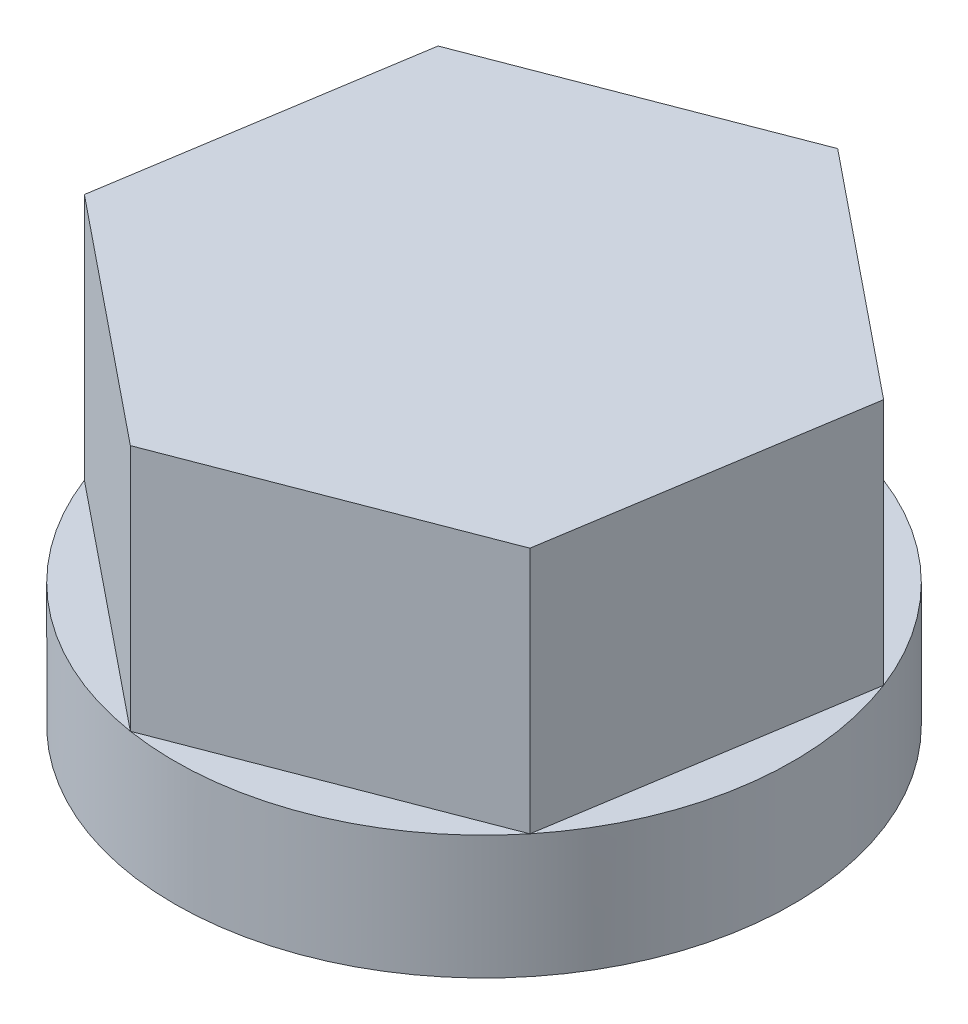
ISO-10303-21;
HEADER;
FILE_DESCRIPTION(('STEP AP214'),'2;1');
FILE_NAME('part.step','',(''),(''),'','','');
FILE_SCHEMA(('AUTOMOTIVE_DESIGN { 1 0 10303 214 1 1 1 1 }'));
ENDSEC;
DATA;
#1=APPLICATION_CONTEXT('core data for automotive mechanical design processes');
#2=APPLICATION_PROTOCOL_DEFINITION('international standard','automotive_design',2000,#1);
#3=PRODUCT_CONTEXT('',#1,'mechanical');
#4=PRODUCT('Part','Part','',(#3));
#5=PRODUCT_RELATED_PRODUCT_CATEGORY('part','',(#4));
#6=PRODUCT_DEFINITION_FORMATION('','',#4);
#7=PRODUCT_DEFINITION_CONTEXT('part definition',#1,'design');
#8=PRODUCT_DEFINITION('design','',#6,#7);
#9=PRODUCT_DEFINITION_SHAPE('','',#8);
#10=(LENGTH_UNIT() NAMED_UNIT(*) SI_UNIT(.MILLI.,.METRE.));
#11=(NAMED_UNIT(*) PLANE_ANGLE_UNIT() SI_UNIT($,.RADIAN.));
#12=(NAMED_UNIT(*) SI_UNIT($,.STERADIAN.) SOLID_ANGLE_UNIT());
#13=UNCERTAINTY_MEASURE_WITH_UNIT(LENGTH_MEASURE(1.E-05),#10,'distance_accuracy_value','');
#14=(GEOMETRIC_REPRESENTATION_CONTEXT(3) GLOBAL_UNCERTAINTY_ASSIGNED_CONTEXT((#13)) GLOBAL_UNIT_ASSIGNED_CONTEXT((#10,
#11,#12)) REPRESENTATION_CONTEXT('',''));
#15=CARTESIAN_POINT('',(0.,0.,0.));
#16=DIRECTION('',(0.,0.,1.));
#17=DIRECTION('',(1.,0.,0.));
#18=AXIS2_PLACEMENT_3D('',#15,#16,#17);
#19=CARTESIAN_POINT('',(0.,1.5,0.));
#20=DIRECTION('',(0.,-1.,0.));
#21=DIRECTION('',(0.,0.,-1.));
#22=AXIS2_PLACEMENT_3D('',#19,#20,#21);
#23=CYLINDRICAL_SURFACE('',#22,1.25);
#24=CARTESIAN_POINT('',(0.,0.,0.));
#25=DIRECTION('',(0.,1.,0.));
#26=DIRECTION('',(0.,0.,1.));
#27=AXIS2_PLACEMENT_3D('',#24,#25,#26);
#28=CIRCLE('',#27,1.25);
#29=CARTESIAN_POINT('',(0.,0.,1.25));
#30=VERTEX_POINT('',#29);
#31=EDGE_CURVE('E12',#30,#30,#28,.T.);
#32=ORIENTED_EDGE('',*,*,#31,.T.);
#33=EDGE_LOOP('',(#32));
#34=FACE_BOUND('',#33,.T.);
#35=CARTESIAN_POINT('',(0.,0.5,0.));
#36=DIRECTION('',(0.,1.,0.));
#37=DIRECTION('',(0.,0.,1.));
#38=AXIS2_PLACEMENT_3D('',#35,#36,#37);
#39=CIRCLE('',#38,1.25);
#40=CARTESIAN_POINT('',(0.971838923851469,0.5,0.786148272329857));
#41=VERTEX_POINT('',#40);
#42=CARTESIAN_POINT('',(1.16674383690464,0.5,-0.448563060276977));
#43=VERTEX_POINT('',#42);
#44=EDGE_CURVE('E146',#41,#43,#39,.T.);
#45=ORIENTED_EDGE('',*,*,#44,.F.);
#46=CARTESIAN_POINT('',(0.,0.5,0.));
#47=DIRECTION('',(0.,1.,0.));
#48=DIRECTION('',(0.,0.,1.));
#49=AXIS2_PLACEMENT_3D('',#46,#47,#48);
#50=CIRCLE('',#49,1.25);
#51=CARTESIAN_POINT('',(-0.194904913053166,0.5,1.23471133260683));
#52=VERTEX_POINT('',#51);
#53=EDGE_CURVE('E154',#52,#41,#50,.T.);
#54=ORIENTED_EDGE('',*,*,#53,.F.);
#55=CARTESIAN_POINT('',(0.,0.5,0.));
#56=DIRECTION('',(0.,1.,0.));
#57=DIRECTION('',(0.,0.,1.));
#58=AXIS2_PLACEMENT_3D('',#55,#56,#57);
#59=CIRCLE('',#58,1.25);
#60=CARTESIAN_POINT('',(-1.16674383690464,0.5,0.448563060276977));
#61=VERTEX_POINT('',#60);
#62=EDGE_CURVE('E385',#61,#52,#59,.T.);
#63=ORIENTED_EDGE('',*,*,#62,.F.);
#64=CARTESIAN_POINT('',(0.,0.5,0.));
#65=DIRECTION('',(0.,1.,0.));
#66=DIRECTION('',(0.,0.,1.));
#67=AXIS2_PLACEMENT_3D('',#64,#65,#66);
#68=CIRCLE('',#67,1.25);
#69=CARTESIAN_POINT('',(-0.971838923851471,0.5,-0.786148272329855));
#70=VERTEX_POINT('',#69);
#71=EDGE_CURVE('E182',#70,#61,#68,.T.);
#72=ORIENTED_EDGE('',*,*,#71,.F.);
#73=CARTESIAN_POINT('',(0.,0.5,0.));
#74=DIRECTION('',(0.,1.,0.));
#75=DIRECTION('',(0.,0.,1.));
#76=AXIS2_PLACEMENT_3D('',#73,#74,#75);
#77=CIRCLE('',#76,1.25);
#78=CARTESIAN_POINT('',(0.194904913053166,0.5,-1.23471133260683));
#79=VERTEX_POINT('',#78);
#80=EDGE_CURVE('E361',#79,#70,#77,.T.);
#81=ORIENTED_EDGE('',*,*,#80,.F.);
#82=CARTESIAN_POINT('',(0.,0.5,0.));
#83=DIRECTION('',(0.,1.,0.));
#84=DIRECTION('',(0.,0.,1.));
#85=AXIS2_PLACEMENT_3D('',#82,#83,#84);
#86=CIRCLE('',#85,1.25);
#87=EDGE_CURVE('E157',#43,#79,#86,.T.);
#88=ORIENTED_EDGE('',*,*,#87,.F.);
#89=EDGE_LOOP('',(#45,#54,#63,#72,#81,#88));
#90=FACE_BOUND('',#89,.T.);
#91=ADVANCED_FACE('F75',(#34,#90),#23,.T.);
#92=CARTESIAN_POINT('',(0.,1.5,0.));
#93=DIRECTION('',(0.,1.,0.));
#94=DIRECTION('',(0.,0.,1.));
#95=AXIS2_PLACEMENT_3D('',#92,#93,#94);
#96=PLANE('',#95);
#97=DIRECTION('',(0.93339506952371,0.,-0.358850448221581));
#98=VECTOR('',#97,1.);
#99=CARTESIAN_POINT('',(0.388467005399151,1.5,1.01042980246834));
#100=LINE('',#99,#98);
#101=CARTESIAN_POINT('',(-0.194904913053166,1.5,1.23471133260683));
#102=VERTEX_POINT('',#101);
#103=CARTESIAN_POINT('',(0.971838923851469,1.5,0.786148272329857));
#104=VERTEX_POINT('',#103);
#105=EDGE_CURVE('E166',#102,#104,#100,.T.);
#106=ORIENTED_EDGE('',*,*,#105,.T.);
#107=DIRECTION('',(0.155923930442533,0.,-0.987769066085465));
#108=VECTOR('',#107,1.);
#109=CARTESIAN_POINT('',(1.06929138037805,1.5,0.16879260602644));
#110=LINE('',#109,#108);
#111=CARTESIAN_POINT('',(1.16674383690464,1.5,-0.448563060276977));
#112=VERTEX_POINT('',#111);
#113=EDGE_CURVE('E134',#104,#112,#110,.T.);
#114=ORIENTED_EDGE('',*,*,#113,.T.);
#115=DIRECTION('',(-0.777471139081176,0.,-0.628918617863885));
#116=VECTOR('',#115,1.);
#117=CARTESIAN_POINT('',(0.680824374978901,1.5,-0.841637196441903));
#118=LINE('',#117,#116);
#119=CARTESIAN_POINT('',(0.194904913053166,1.5,-1.23471133260683));
#120=VERTEX_POINT('',#119);
#121=EDGE_CURVE('E375',#112,#120,#118,.T.);
#122=ORIENTED_EDGE('',*,*,#121,.T.);
#123=DIRECTION('',(-0.93339506952371,0.,0.35885044822158));
#124=VECTOR('',#123,1.);
#125=CARTESIAN_POINT('',(-0.388467005399151,1.5,-1.01042980246834));
#126=LINE('',#125,#124);
#127=CARTESIAN_POINT('',(-0.971838923851471,1.5,-0.786148272329855));
#128=VERTEX_POINT('',#127);
#129=EDGE_CURVE('E98',#120,#128,#126,.T.);
#130=ORIENTED_EDGE('',*,*,#129,.T.);
#131=DIRECTION('',(-0.155923930442534,0.,0.987769066085465));
#132=VECTOR('',#131,1.);
#133=CARTESIAN_POINT('',(-1.06929138037805,1.5,-0.16879260602644));
#134=LINE('',#133,#132);
#135=CARTESIAN_POINT('',(-1.16674383690464,1.5,0.448563060276976));
#136=VERTEX_POINT('',#135);
#137=EDGE_CURVE('E183',#128,#136,#134,.T.);
#138=ORIENTED_EDGE('',*,*,#137,.T.);
#139=DIRECTION('',(0.777471139081176,0.,0.628918617863885));
#140=VECTOR('',#139,1.);
#141=CARTESIAN_POINT('',(-0.680824374978902,1.5,0.841637196441903));
#142=LINE('',#141,#140);
#143=EDGE_CURVE('E90',#136,#102,#142,.T.);
#144=ORIENTED_EDGE('',*,*,#143,.T.);
#145=EDGE_LOOP('',(#106,#114,#122,#130,#138,#144));
#146=FACE_BOUND('',#145,.T.);
#147=ADVANCED_FACE('F204',(#146),#96,.T.);
#148=CARTESIAN_POINT('',(0.,0.,0.));
#149=DIRECTION('',(0.,1.,0.));
#150=DIRECTION('',(0.,0.,1.));
#151=AXIS2_PLACEMENT_3D('',#148,#149,#150);
#152=PLANE('',#151);
#153=CARTESIAN_POINT('',(0.,0.,0.));
#154=DIRECTION('',(0.,-1.,0.));
#155=DIRECTION('',(0.,0.,-1.));
#156=AXIS2_PLACEMENT_3D('',#153,#154,#155);
#157=CIRCLE('',#156,0.95);
#158=CARTESIAN_POINT('',(0.,0.,-0.95));
#159=VERTEX_POINT('',#158);
#160=EDGE_CURVE('E140',#159,#159,#157,.T.);
#161=ORIENTED_EDGE('',*,*,#160,.F.);
#162=EDGE_LOOP('',(#161));
#163=FACE_BOUND('',#162,.T.);
#164=ORIENTED_EDGE('',*,*,#31,.F.);
#165=EDGE_LOOP('',(#164));
#166=FACE_BOUND('',#165,.T.);
#167=ADVANCED_FACE('F201',(#163,#166),#152,.F.);
#168=CARTESIAN_POINT('',(0.,1.2,0.));
#169=DIRECTION('',(0.,-1.,0.));
#170=DIRECTION('',(0.,0.,-1.));
#171=AXIS2_PLACEMENT_3D('',#168,#169,#170);
#172=CYLINDRICAL_SURFACE('',#171,0.95);
#173=CARTESIAN_POINT('',(0.,1.2,0.));
#174=DIRECTION('',(0.,-1.,0.));
#175=DIRECTION('',(0.,0.,-1.));
#176=AXIS2_PLACEMENT_3D('',#173,#174,#175);
#177=CIRCLE('',#176,0.95);
#178=CARTESIAN_POINT('',(0.,1.2,-0.95));
#179=VERTEX_POINT('',#178);
#180=EDGE_CURVE('E83',#179,#179,#177,.T.);
#181=ORIENTED_EDGE('',*,*,#180,.F.);
#182=EDGE_LOOP('',(#181));
#183=FACE_BOUND('',#182,.T.);
#184=ORIENTED_EDGE('',*,*,#160,.T.);
#185=EDGE_LOOP('',(#184));
#186=FACE_BOUND('',#185,.T.);
#187=ADVANCED_FACE('F199',(#183,#186),#172,.F.);
#188=CARTESIAN_POINT('',(0.,1.2,0.));
#189=DIRECTION('',(0.,-1.,0.));
#190=DIRECTION('',(0.,0.,-1.));
#191=AXIS2_PLACEMENT_3D('',#188,#189,#190);
#192=PLANE('',#191);
#193=ORIENTED_EDGE('',*,*,#180,.T.);
#194=EDGE_LOOP('',(#193));
#195=FACE_BOUND('',#194,.T.);
#196=ADVANCED_FACE('F218',(#195),#192,.T.);
#197=CARTESIAN_POINT('',(0.388467005399151,0.5,1.01042980246834));
#198=DIRECTION('',(0.358850448221581,0.,0.93339506952371));
#199=DIRECTION('',(0.93339506952371,0.,-0.358850448221581));
#200=AXIS2_PLACEMENT_3D('',#197,#198,#199);
#201=PLANE('',#200);
#202=ORIENTED_EDGE('',*,*,#105,.F.);
#203=DIRECTION('',(0.,1.,0.));
#204=VECTOR('',#203,1.);
#205=CARTESIAN_POINT('',(-0.194904913053166,0.5,1.23471133260683));
#206=LINE('',#205,#204);
#207=EDGE_CURVE('E141',#52,#102,#206,.T.);
#208=ORIENTED_EDGE('',*,*,#207,.F.);
#209=DIRECTION('',(0.93339506952371,0.,-0.358850448221581));
#210=VECTOR('',#209,1.);
#211=CARTESIAN_POINT('',(0.388467005399151,0.5,1.01042980246834));
#212=LINE('',#211,#210);
#213=EDGE_CURVE('E162',#52,#41,#212,.T.);
#214=ORIENTED_EDGE('',*,*,#213,.T.);
#215=DIRECTION('',(0.,1.,0.));
#216=VECTOR('',#215,1.);
#217=CARTESIAN_POINT('',(0.971838923851469,0.5,0.786148272329857));
#218=LINE('',#217,#216);
#219=EDGE_CURVE('E128',#41,#104,#218,.T.);
#220=ORIENTED_EDGE('',*,*,#219,.T.);
#221=EDGE_LOOP('',(#202,#208,#214,#220));
#222=FACE_BOUND('',#221,.T.);
#223=ADVANCED_FACE('F163',(#222),#201,.T.);
#224=CARTESIAN_POINT('',(0.,0.5,0.));
#225=DIRECTION('',(0.,1.,0.));
#226=DIRECTION('',(0.,0.,1.));
#227=AXIS2_PLACEMENT_3D('',#224,#225,#226);
#228=PLANE('',#227);
#229=ORIENTED_EDGE('',*,*,#213,.F.);
#230=ORIENTED_EDGE('',*,*,#53,.T.);
#231=EDGE_LOOP('',(#229,#230));
#232=FACE_BOUND('',#231,.T.);
#233=ADVANCED_FACE('F168',(#232),#228,.T.);
#234=CARTESIAN_POINT('',(-1.06929138037805,0.5,-0.16879260602644));
#235=DIRECTION('',(-0.987769066085465,0.,-0.155923930442534));
#236=DIRECTION('',(-0.155923930442534,0.,0.987769066085465));
#237=AXIS2_PLACEMENT_3D('',#234,#235,#236);
#238=PLANE('',#237);
#239=ORIENTED_EDGE('',*,*,#137,.F.);
#240=DIRECTION('',(0.,1.,0.));
#241=VECTOR('',#240,1.);
#242=CARTESIAN_POINT('',(-0.971838923851471,0.5,-0.786148272329855));
#243=LINE('',#242,#241);
#244=EDGE_CURVE('E176',#70,#128,#243,.T.);
#245=ORIENTED_EDGE('',*,*,#244,.F.);
#246=DIRECTION('',(-0.155923930442534,0.,0.987769066085465));
#247=VECTOR('',#246,1.);
#248=CARTESIAN_POINT('',(-1.06929138037805,0.5,-0.16879260602644));
#249=LINE('',#248,#247);
#250=EDGE_CURVE('E178',#70,#61,#249,.T.);
#251=ORIENTED_EDGE('',*,*,#250,.T.);
#252=DIRECTION('',(0.,1.,0.));
#253=VECTOR('',#252,1.);
#254=CARTESIAN_POINT('',(-1.16674383690464,0.5,0.448563060276977));
#255=LINE('',#254,#253);
#256=EDGE_CURVE('E383',#61,#136,#255,.T.);
#257=ORIENTED_EDGE('',*,*,#256,.T.);
#258=EDGE_LOOP('',(#239,#245,#251,#257));
#259=FACE_BOUND('',#258,.T.);
#260=ADVANCED_FACE('F223',(#259),#238,.T.);
#261=CARTESIAN_POINT('',(0.,0.5,0.));
#262=DIRECTION('',(0.,1.,0.));
#263=DIRECTION('',(0.,0.,1.));
#264=AXIS2_PLACEMENT_3D('',#261,#262,#263);
#265=PLANE('',#264);
#266=ORIENTED_EDGE('',*,*,#250,.F.);
#267=ORIENTED_EDGE('',*,*,#71,.T.);
#268=EDGE_LOOP('',(#266,#267));
#269=FACE_BOUND('',#268,.T.);
#270=ADVANCED_FACE('F226',(#269),#265,.T.);
#271=CARTESIAN_POINT('',(0.680824374978901,0.5,-0.841637196441903));
#272=DIRECTION('',(0.628918617863884,0.,-0.777471139081176));
#273=DIRECTION('',(-0.777471139081176,0.,-0.628918617863884));
#274=AXIS2_PLACEMENT_3D('',#271,#272,#273);
#275=PLANE('',#274);
#276=ORIENTED_EDGE('',*,*,#121,.F.);
#277=DIRECTION('',(0.,1.,0.));
#278=VECTOR('',#277,1.);
#279=CARTESIAN_POINT('',(1.16674383690464,0.5,-0.448563060276977));
#280=LINE('',#279,#278);
#281=EDGE_CURVE('E190',#43,#112,#280,.T.);
#282=ORIENTED_EDGE('',*,*,#281,.F.);
#283=DIRECTION('',(-0.777471139081176,0.,-0.628918617863885));
#284=VECTOR('',#283,1.);
#285=CARTESIAN_POINT('',(0.680824374978901,0.5,-0.841637196441903));
#286=LINE('',#285,#284);
#287=EDGE_CURVE('E371',#43,#79,#286,.T.);
#288=ORIENTED_EDGE('',*,*,#287,.T.);
#289=DIRECTION('',(0.,1.,0.));
#290=VECTOR('',#289,1.);
#291=CARTESIAN_POINT('',(0.194904913053166,0.5,-1.23471133260683));
#292=LINE('',#291,#290);
#293=EDGE_CURVE('E368',#79,#120,#292,.T.);
#294=ORIENTED_EDGE('',*,*,#293,.T.);
#295=EDGE_LOOP('',(#276,#282,#288,#294));
#296=FACE_BOUND('',#295,.T.);
#297=ADVANCED_FACE('F230',(#296),#275,.T.);
#298=CARTESIAN_POINT('',(0.,0.5,0.));
#299=DIRECTION('',(0.,1.,0.));
#300=DIRECTION('',(0.,0.,1.));
#301=AXIS2_PLACEMENT_3D('',#298,#299,#300);
#302=PLANE('',#301);
#303=ORIENTED_EDGE('',*,*,#287,.F.);
#304=ORIENTED_EDGE('',*,*,#87,.T.);
#305=EDGE_LOOP('',(#303,#304));
#306=FACE_BOUND('',#305,.T.);
#307=ADVANCED_FACE('F238',(#306),#302,.T.);
#308=CARTESIAN_POINT('',(-0.680824374978902,0.5,0.841637196441903));
#309=DIRECTION('',(-0.628918617863885,0.,0.777471139081176));
#310=DIRECTION('',(0.777471139081176,0.,0.628918617863885));
#311=AXIS2_PLACEMENT_3D('',#308,#309,#310);
#312=PLANE('',#311);
#313=ORIENTED_EDGE('',*,*,#143,.F.);
#314=ORIENTED_EDGE('',*,*,#256,.F.);
#315=DIRECTION('',(0.777471139081176,0.,0.628918617863885));
#316=VECTOR('',#315,1.);
#317=CARTESIAN_POINT('',(-0.680824374978902,0.5,0.841637196441903));
#318=LINE('',#317,#316);
#319=EDGE_CURVE('E389',#61,#52,#318,.T.);
#320=ORIENTED_EDGE('',*,*,#319,.T.);
#321=ORIENTED_EDGE('',*,*,#207,.T.);
#322=EDGE_LOOP('',(#313,#314,#320,#321));
#323=FACE_BOUND('',#322,.T.);
#324=ADVANCED_FACE('F242',(#323),#312,.T.);
#325=CARTESIAN_POINT('',(0.,0.5,0.));
#326=DIRECTION('',(0.,1.,0.));
#327=DIRECTION('',(0.,0.,1.));
#328=AXIS2_PLACEMENT_3D('',#325,#326,#327);
#329=PLANE('',#328);
#330=ORIENTED_EDGE('',*,*,#319,.F.);
#331=ORIENTED_EDGE('',*,*,#62,.T.);
#332=EDGE_LOOP('',(#330,#331));
#333=FACE_BOUND('',#332,.T.);
#334=ADVANCED_FACE('F246',(#333),#329,.T.);
#335=CARTESIAN_POINT('',(-0.388467005399151,0.5,-1.01042980246834));
#336=DIRECTION('',(-0.35885044822158,0.,-0.93339506952371));
#337=DIRECTION('',(-0.93339506952371,0.,0.35885044822158));
#338=AXIS2_PLACEMENT_3D('',#335,#336,#337);
#339=PLANE('',#338);
#340=ORIENTED_EDGE('',*,*,#129,.F.);
#341=ORIENTED_EDGE('',*,*,#293,.F.);
#342=DIRECTION('',(-0.93339506952371,0.,0.35885044822158));
#343=VECTOR('',#342,1.);
#344=CARTESIAN_POINT('',(-0.388467005399151,0.5,-1.01042980246834));
#345=LINE('',#344,#343);
#346=EDGE_CURVE('E360',#79,#70,#345,.T.);
#347=ORIENTED_EDGE('',*,*,#346,.T.);
#348=ORIENTED_EDGE('',*,*,#244,.T.);
#349=EDGE_LOOP('',(#340,#341,#347,#348));
#350=FACE_BOUND('',#349,.T.);
#351=ADVANCED_FACE('F249',(#350),#339,.T.);
#352=CARTESIAN_POINT('',(0.,0.5,0.));
#353=DIRECTION('',(0.,1.,0.));
#354=DIRECTION('',(0.,0.,1.));
#355=AXIS2_PLACEMENT_3D('',#352,#353,#354);
#356=PLANE('',#355);
#357=ORIENTED_EDGE('',*,*,#346,.F.);
#358=ORIENTED_EDGE('',*,*,#80,.T.);
#359=EDGE_LOOP('',(#357,#358));
#360=FACE_BOUND('',#359,.T.);
#361=ADVANCED_FACE('F253',(#360),#356,.T.);
#362=CARTESIAN_POINT('',(1.06929138037805,0.5,0.16879260602644));
#363=DIRECTION('',(0.987769066085465,0.,0.155923930442533));
#364=DIRECTION('',(0.155923930442533,0.,-0.987769066085465));
#365=AXIS2_PLACEMENT_3D('',#362,#363,#364);
#366=PLANE('',#365);
#367=ORIENTED_EDGE('',*,*,#113,.F.);
#368=ORIENTED_EDGE('',*,*,#219,.F.);
#369=DIRECTION('',(0.155923930442533,0.,-0.987769066085465));
#370=VECTOR('',#369,1.);
#371=CARTESIAN_POINT('',(1.06929138037805,0.5,0.16879260602644));
#372=LINE('',#371,#370);
#373=EDGE_CURVE('E131',#41,#43,#372,.T.);
#374=ORIENTED_EDGE('',*,*,#373,.T.);
#375=ORIENTED_EDGE('',*,*,#281,.T.);
#376=EDGE_LOOP('',(#367,#368,#374,#375));
#377=FACE_BOUND('',#376,.T.);
#378=ADVANCED_FACE('F130',(#377),#366,.T.);
#379=CARTESIAN_POINT('',(0.,0.5,0.));
#380=DIRECTION('',(0.,1.,0.));
#381=DIRECTION('',(0.,0.,1.));
#382=AXIS2_PLACEMENT_3D('',#379,#380,#381);
#383=PLANE('',#382);
#384=ORIENTED_EDGE('',*,*,#373,.F.);
#385=ORIENTED_EDGE('',*,*,#44,.T.);
#386=EDGE_LOOP('',(#384,#385));
#387=FACE_BOUND('',#386,.T.);
#388=ADVANCED_FACE('F145',(#387),#383,.T.);
#389=CLOSED_SHELL('',(#91,#147,#167,#187,#196,#223,#233,#260,#270,#297,#307,#324,#334,#351,#361,
#378,#388));
#390=MANIFOLD_SOLID_BREP('B2',#389);
#391=ADVANCED_BREP_SHAPE_REPRESENTATION('',(#18,#390),#14);
#392=SHAPE_DEFINITION_REPRESENTATION(#9,#391);
ENDSEC;
END-ISO-10303-21;
